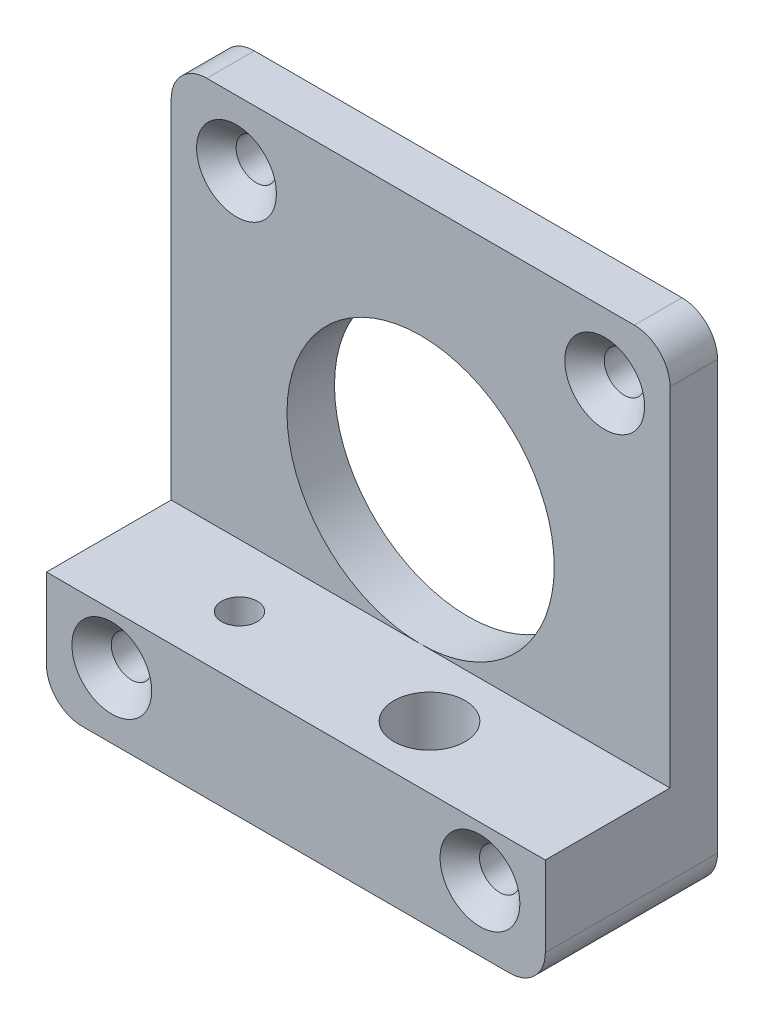
ISO-10303-21;
HEADER;
FILE_DESCRIPTION(('STEP AP214'),'2;1');
FILE_NAME('part.step','',(''),(''),'','','');
FILE_SCHEMA(('AUTOMOTIVE_DESIGN { 1 0 10303 214 1 1 1 1 }'));
ENDSEC;
DATA;
#1=APPLICATION_CONTEXT('core data for automotive mechanical design processes');
#2=APPLICATION_PROTOCOL_DEFINITION('international standard','automotive_design',2000,#1);
#3=PRODUCT_CONTEXT('',#1,'mechanical');
#4=PRODUCT('Part','Part','',(#3));
#5=PRODUCT_RELATED_PRODUCT_CATEGORY('part','',(#4));
#6=PRODUCT_DEFINITION_FORMATION('','',#4);
#7=PRODUCT_DEFINITION_CONTEXT('part definition',#1,'design');
#8=PRODUCT_DEFINITION('design','',#6,#7);
#9=PRODUCT_DEFINITION_SHAPE('','',#8);
#10=(LENGTH_UNIT() NAMED_UNIT(*) SI_UNIT(.MILLI.,.METRE.));
#11=(NAMED_UNIT(*) PLANE_ANGLE_UNIT() SI_UNIT($,.RADIAN.));
#12=(NAMED_UNIT(*) SI_UNIT($,.STERADIAN.) SOLID_ANGLE_UNIT());
#13=UNCERTAINTY_MEASURE_WITH_UNIT(LENGTH_MEASURE(1.E-05),#10,'distance_accuracy_value','');
#14=(GEOMETRIC_REPRESENTATION_CONTEXT(3) GLOBAL_UNCERTAINTY_ASSIGNED_CONTEXT((#13)) GLOBAL_UNIT_ASSIGNED_CONTEXT((#10,
#11,#12)) REPRESENTATION_CONTEXT('',''));
#15=CARTESIAN_POINT('',(0.,0.,0.));
#16=DIRECTION('',(0.,0.,1.));
#17=DIRECTION('',(1.,0.,0.));
#18=AXIS2_PLACEMENT_3D('',#15,#16,#17);
#19=CARTESIAN_POINT('',(-18.,-18.,4.));
#20=DIRECTION('',(0.,0.,1.));
#21=DIRECTION('',(1.,0.,0.));
#22=AXIS2_PLACEMENT_3D('',#19,#20,#21);
#23=PLANE('',#22);
#24=CARTESIAN_POINT('',(-15.5,15.5,4.));
#25=DIRECTION('',(0.,0.,1.));
#26=DIRECTION('',(1.,0.,0.));
#27=AXIS2_PLACEMENT_3D('',#24,#25,#26);
#28=CIRCLE('',#27,3.36);
#29=CARTESIAN_POINT('',(-12.14,15.5,4.));
#30=VERTEX_POINT('',#29);
#31=EDGE_CURVE('E478',#30,#30,#28,.T.);
#32=ORIENTED_EDGE('',*,*,#31,.F.);
#33=EDGE_LOOP('',(#32));
#34=FACE_BOUND('',#33,.T.);
#35=CARTESIAN_POINT('',(15.5,15.5,4.));
#36=DIRECTION('',(0.,0.,1.));
#37=DIRECTION('',(1.,0.,0.));
#38=AXIS2_PLACEMENT_3D('',#35,#36,#37);
#39=CIRCLE('',#38,3.36);
#40=CARTESIAN_POINT('',(18.86,15.5,4.));
#41=VERTEX_POINT('',#40);
#42=EDGE_CURVE('E469',#41,#41,#39,.T.);
#43=ORIENTED_EDGE('',*,*,#42,.F.);
#44=EDGE_LOOP('',(#43));
#45=FACE_BOUND('',#44,.T.);
#46=DIRECTION('',(-1.,0.,0.));
#47=VECTOR('',#46,1.);
#48=CARTESIAN_POINT('',(-21.,-11.25,4.));
#49=LINE('',#48,#47);
#50=CARTESIAN_POINT('',(21.,-11.25,4.));
#51=VERTEX_POINT('',#50);
#52=CARTESIAN_POINT('',(0.,-11.25,4.));
#53=VERTEX_POINT('',#52);
#54=EDGE_CURVE('E42',#51,#53,#49,.T.);
#55=ORIENTED_EDGE('',*,*,#54,.F.);
#56=DIRECTION('',(0.,1.,0.));
#57=VECTOR('',#56,1.);
#58=CARTESIAN_POINT('',(21.,18.,4.));
#59=LINE('',#58,#57);
#60=CARTESIAN_POINT('',(21.,18.,4.));
#61=VERTEX_POINT('',#60);
#62=EDGE_CURVE('E162',#51,#61,#59,.T.);
#63=ORIENTED_EDGE('',*,*,#62,.T.);
#64=CARTESIAN_POINT('',(18.,18.,4.));
#65=DIRECTION('',(0.,0.,1.));
#66=DIRECTION('',(-1.,0.,0.));
#67=AXIS2_PLACEMENT_3D('',#64,#65,#66);
#68=CIRCLE('',#67,3.);
#69=CARTESIAN_POINT('',(18.,21.,4.));
#70=VERTEX_POINT('',#69);
#71=EDGE_CURVE('E164',#61,#70,#68,.T.);
#72=ORIENTED_EDGE('',*,*,#71,.T.);
#73=DIRECTION('',(-1.,0.,0.));
#74=VECTOR('',#73,1.);
#75=CARTESIAN_POINT('',(-18.,21.,4.));
#76=LINE('',#75,#74);
#77=CARTESIAN_POINT('',(-18.,21.,4.));
#78=VERTEX_POINT('',#77);
#79=EDGE_CURVE('E166',#70,#78,#76,.T.);
#80=ORIENTED_EDGE('',*,*,#79,.T.);
#81=CARTESIAN_POINT('',(-18.,18.,4.));
#82=DIRECTION('',(0.,0.,1.));
#83=DIRECTION('',(1.,0.,0.));
#84=AXIS2_PLACEMENT_3D('',#81,#82,#83);
#85=CIRCLE('',#84,3.);
#86=CARTESIAN_POINT('',(-21.,18.,4.));
#87=VERTEX_POINT('',#86);
#88=EDGE_CURVE('E168',#78,#87,#85,.T.);
#89=ORIENTED_EDGE('',*,*,#88,.T.);
#90=DIRECTION('',(0.,-1.,0.));
#91=VECTOR('',#90,1.);
#92=CARTESIAN_POINT('',(-21.,18.,4.));
#93=LINE('',#92,#91);
#94=CARTESIAN_POINT('',(-21.,-11.25,4.));
#95=VERTEX_POINT('',#94);
#96=EDGE_CURVE('E124',#87,#95,#93,.T.);
#97=ORIENTED_EDGE('',*,*,#96,.T.);
#98=EDGE_CURVE('E11',#53,#95,#49,.T.);
#99=ORIENTED_EDGE('',*,*,#98,.F.);
#100=CARTESIAN_POINT('',(0.,0.,4.));
#101=DIRECTION('',(0.,0.,1.));
#102=DIRECTION('',(1.,0.,0.));
#103=AXIS2_PLACEMENT_3D('',#100,#101,#102);
#104=CIRCLE('',#103,11.25);
#105=EDGE_CURVE('E157',#53,#53,#104,.T.);
#106=ORIENTED_EDGE('',*,*,#105,.F.);
#107=EDGE_LOOP('',(#55,#63,#72,#80,#89,#97,#99,#106));
#108=FACE_BOUND('',#107,.T.);
#109=ADVANCED_FACE('F32',(#34,#45,#108),#23,.T.);
#110=CARTESIAN_POINT('',(-18.,-18.,0.));
#111=DIRECTION('',(0.,0.,1.));
#112=DIRECTION('',(1.,0.,0.));
#113=AXIS2_PLACEMENT_3D('',#110,#111,#112);
#114=PLANE('',#113);
#115=CARTESIAN_POINT('',(-15.5,-15.5,0.));
#116=DIRECTION('',(0.,0.,1.));
#117=DIRECTION('',(1.,0.,0.));
#118=AXIS2_PLACEMENT_3D('',#115,#116,#117);
#119=CIRCLE('',#118,1.7);
#120=CARTESIAN_POINT('',(-13.8,-15.5,0.));
#121=VERTEX_POINT('',#120);
#122=EDGE_CURVE('E490',#121,#121,#119,.T.);
#123=ORIENTED_EDGE('',*,*,#122,.T.);
#124=EDGE_LOOP('',(#123));
#125=FACE_BOUND('',#124,.T.);
#126=CARTESIAN_POINT('',(15.5,-15.5,0.));
#127=DIRECTION('',(0.,0.,1.));
#128=DIRECTION('',(1.,0.,0.));
#129=AXIS2_PLACEMENT_3D('',#126,#127,#128);
#130=CIRCLE('',#129,1.7);
#131=CARTESIAN_POINT('',(17.2,-15.5,0.));
#132=VERTEX_POINT('',#131);
#133=EDGE_CURVE('E481',#132,#132,#130,.T.);
#134=ORIENTED_EDGE('',*,*,#133,.T.);
#135=EDGE_LOOP('',(#134));
#136=FACE_BOUND('',#135,.T.);
#137=CARTESIAN_POINT('',(-15.5,15.5,0.));
#138=DIRECTION('',(0.,0.,1.));
#139=DIRECTION('',(1.,0.,0.));
#140=AXIS2_PLACEMENT_3D('',#137,#138,#139);
#141=CIRCLE('',#140,1.7);
#142=CARTESIAN_POINT('',(-13.8,15.5,0.));
#143=VERTEX_POINT('',#142);
#144=EDGE_CURVE('E472',#143,#143,#141,.T.);
#145=ORIENTED_EDGE('',*,*,#144,.T.);
#146=EDGE_LOOP('',(#145));
#147=FACE_BOUND('',#146,.T.);
#148=CARTESIAN_POINT('',(15.5,15.5,0.));
#149=DIRECTION('',(0.,0.,1.));
#150=DIRECTION('',(1.,0.,0.));
#151=AXIS2_PLACEMENT_3D('',#148,#149,#150);
#152=CIRCLE('',#151,1.7);
#153=CARTESIAN_POINT('',(17.2,15.5,0.));
#154=VERTEX_POINT('',#153);
#155=EDGE_CURVE('E459',#154,#154,#152,.T.);
#156=ORIENTED_EDGE('',*,*,#155,.T.);
#157=EDGE_LOOP('',(#156));
#158=FACE_BOUND('',#157,.T.);
#159=CARTESIAN_POINT('',(-18.,-18.,0.));
#160=DIRECTION('',(0.,0.,1.));
#161=DIRECTION('',(1.,0.,0.));
#162=AXIS2_PLACEMENT_3D('',#159,#160,#161);
#163=CIRCLE('',#162,3.);
#164=CARTESIAN_POINT('',(-21.,-18.,0.));
#165=VERTEX_POINT('',#164);
#166=CARTESIAN_POINT('',(-18.,-21.,0.));
#167=VERTEX_POINT('',#166);
#168=EDGE_CURVE('E159',#165,#167,#163,.T.);
#169=ORIENTED_EDGE('',*,*,#168,.F.);
#170=DIRECTION('',(0.,-1.,0.));
#171=VECTOR('',#170,1.);
#172=CARTESIAN_POINT('',(-21.,18.,0.));
#173=LINE('',#172,#171);
#174=CARTESIAN_POINT('',(-21.,18.,0.));
#175=VERTEX_POINT('',#174);
#176=EDGE_CURVE('E119',#175,#165,#173,.T.);
#177=ORIENTED_EDGE('',*,*,#176,.F.);
#178=CARTESIAN_POINT('',(-18.,18.,0.));
#179=DIRECTION('',(0.,0.,1.));
#180=DIRECTION('',(1.,0.,0.));
#181=AXIS2_PLACEMENT_3D('',#178,#179,#180);
#182=CIRCLE('',#181,3.);
#183=CARTESIAN_POINT('',(-18.,21.,0.));
#184=VERTEX_POINT('',#183);
#185=EDGE_CURVE('E182',#184,#175,#182,.T.);
#186=ORIENTED_EDGE('',*,*,#185,.F.);
#187=DIRECTION('',(-1.,0.,0.));
#188=VECTOR('',#187,1.);
#189=CARTESIAN_POINT('',(-18.,21.,0.));
#190=LINE('',#189,#188);
#191=CARTESIAN_POINT('',(18.,21.,0.));
#192=VERTEX_POINT('',#191);
#193=EDGE_CURVE('E180',#192,#184,#190,.T.);
#194=ORIENTED_EDGE('',*,*,#193,.F.);
#195=CARTESIAN_POINT('',(18.,18.,0.));
#196=DIRECTION('',(0.,0.,1.));
#197=DIRECTION('',(-1.,0.,0.));
#198=AXIS2_PLACEMENT_3D('',#195,#196,#197);
#199=CIRCLE('',#198,3.);
#200=CARTESIAN_POINT('',(21.,18.,0.));
#201=VERTEX_POINT('',#200);
#202=EDGE_CURVE('E178',#201,#192,#199,.T.);
#203=ORIENTED_EDGE('',*,*,#202,.F.);
#204=DIRECTION('',(0.,1.,0.));
#205=VECTOR('',#204,1.);
#206=CARTESIAN_POINT('',(21.,18.,0.));
#207=LINE('',#206,#205);
#208=CARTESIAN_POINT('',(21.,-18.,0.));
#209=VERTEX_POINT('',#208);
#210=EDGE_CURVE('E176',#209,#201,#207,.T.);
#211=ORIENTED_EDGE('',*,*,#210,.F.);
#212=CARTESIAN_POINT('',(18.,-18.,0.));
#213=DIRECTION('',(0.,0.,1.));
#214=DIRECTION('',(1.,0.,0.));
#215=AXIS2_PLACEMENT_3D('',#212,#213,#214);
#216=CIRCLE('',#215,2.99999999999999);
#217=CARTESIAN_POINT('',(18.,-21.,0.));
#218=VERTEX_POINT('',#217);
#219=EDGE_CURVE('E174',#218,#209,#216,.T.);
#220=ORIENTED_EDGE('',*,*,#219,.F.);
#221=DIRECTION('',(1.,0.,0.));
#222=VECTOR('',#221,1.);
#223=CARTESIAN_POINT('',(-18.,-21.,0.));
#224=LINE('',#223,#222);
#225=EDGE_CURVE('E172',#167,#218,#224,.T.);
#226=ORIENTED_EDGE('',*,*,#225,.F.);
#227=EDGE_LOOP('',(#169,#177,#186,#194,#203,#211,#220,#226));
#228=FACE_BOUND('',#227,.T.);
#229=CARTESIAN_POINT('',(0.,0.,0.));
#230=DIRECTION('',(0.,0.,1.));
#231=DIRECTION('',(1.,0.,0.));
#232=AXIS2_PLACEMENT_3D('',#229,#230,#231);
#233=CIRCLE('',#232,11.25);
#234=CARTESIAN_POINT('',(11.25,0.,0.));
#235=VERTEX_POINT('',#234);
#236=EDGE_CURVE('E156',#235,#235,#233,.T.);
#237=ORIENTED_EDGE('',*,*,#236,.T.);
#238=EDGE_LOOP('',(#237));
#239=FACE_BOUND('',#238,.T.);
#240=ADVANCED_FACE('F205',(#125,#136,#147,#158,#228,#239),#114,.F.);
#241=CARTESIAN_POINT('',(-18.,-18.,4.));
#242=DIRECTION('',(0.,0.,-1.));
#243=DIRECTION('',(-1.,0.,0.));
#244=AXIS2_PLACEMENT_3D('',#241,#242,#243);
#245=CYLINDRICAL_SURFACE('',#244,3.);
#246=ORIENTED_EDGE('',*,*,#168,.T.);
#247=DIRECTION('',(0.,0.,-1.));
#248=VECTOR('',#247,1.);
#249=CARTESIAN_POINT('',(-18.,-21.,4.));
#250=LINE('',#249,#248);
#251=CARTESIAN_POINT('',(-18.,-21.,14.5));
#252=VERTEX_POINT('',#251);
#253=EDGE_CURVE('E36',#252,#167,#250,.T.);
#254=ORIENTED_EDGE('',*,*,#253,.F.);
#255=CARTESIAN_POINT('',(-18.,-18.,14.5));
#256=DIRECTION('',(0.,0.,1.));
#257=DIRECTION('',(1.,0.,0.));
#258=AXIS2_PLACEMENT_3D('',#255,#256,#257);
#259=CIRCLE('',#258,3.);
#260=CARTESIAN_POINT('',(-21.,-18.,14.5));
#261=VERTEX_POINT('',#260);
#262=EDGE_CURVE('E127',#261,#252,#259,.T.);
#263=ORIENTED_EDGE('',*,*,#262,.F.);
#264=DIRECTION('',(0.,0.,-1.));
#265=VECTOR('',#264,1.);
#266=CARTESIAN_POINT('',(-21.,-18.,4.));
#267=LINE('',#266,#265);
#268=EDGE_CURVE('E111',#261,#165,#267,.T.);
#269=ORIENTED_EDGE('',*,*,#268,.T.);
#270=EDGE_LOOP('',(#246,#254,#263,#269));
#271=FACE_BOUND('',#270,.T.);
#272=ADVANCED_FACE('F34',(#271),#245,.T.);
#273=CARTESIAN_POINT('',(-18.,-21.,4.));
#274=DIRECTION('',(0.,1.,0.));
#275=DIRECTION('',(-1.,0.,0.));
#276=AXIS2_PLACEMENT_3D('',#273,#274,#275);
#277=PLANE('',#276);
#278=CARTESIAN_POINT('',(5.99999999999999,-21.,9.25));
#279=DIRECTION('',(0.,1.,0.));
#280=DIRECTION('',(-1.,0.,0.));
#281=AXIS2_PLACEMENT_3D('',#278,#279,#280);
#282=CIRCLE('',#281,3.);
#283=CARTESIAN_POINT('',(2.99999999999999,-21.,9.25));
#284=VERTEX_POINT('',#283);
#285=EDGE_CURVE('E139',#284,#284,#282,.F.);
#286=ORIENTED_EDGE('',*,*,#285,.F.);
#287=EDGE_LOOP('',(#286));
#288=FACE_BOUND('',#287,.T.);
#289=CARTESIAN_POINT('',(-10.,-21.,9.25));
#290=DIRECTION('',(0.,1.,0.));
#291=DIRECTION('',(-1.,0.,0.));
#292=AXIS2_PLACEMENT_3D('',#289,#290,#291);
#293=CIRCLE('',#292,1.5);
#294=CARTESIAN_POINT('',(-11.5,-21.,9.25));
#295=VERTEX_POINT('',#294);
#296=EDGE_CURVE('E141',#295,#295,#293,.F.);
#297=ORIENTED_EDGE('',*,*,#296,.F.);
#298=EDGE_LOOP('',(#297));
#299=FACE_BOUND('',#298,.T.);
#300=ORIENTED_EDGE('',*,*,#225,.T.);
#301=DIRECTION('',(0.,0.,-1.));
#302=VECTOR('',#301,1.);
#303=CARTESIAN_POINT('',(18.,-21.,4.));
#304=LINE('',#303,#302);
#305=CARTESIAN_POINT('',(18.,-21.,14.5));
#306=VERTEX_POINT('',#305);
#307=EDGE_CURVE('E197',#306,#218,#304,.T.);
#308=ORIENTED_EDGE('',*,*,#307,.F.);
#309=DIRECTION('',(1.,0.,0.));
#310=VECTOR('',#309,1.);
#311=CARTESIAN_POINT('',(-18.,-21.,14.5));
#312=LINE('',#311,#310);
#313=EDGE_CURVE('E132',#252,#306,#312,.T.);
#314=ORIENTED_EDGE('',*,*,#313,.F.);
#315=ORIENTED_EDGE('',*,*,#253,.T.);
#316=EDGE_LOOP('',(#300,#308,#314,#315));
#317=FACE_BOUND('',#316,.T.);
#318=ADVANCED_FACE('F203',(#288,#299,#317),#277,.F.);
#319=CARTESIAN_POINT('',(18.,-18.,4.));
#320=DIRECTION('',(0.,0.,-1.));
#321=DIRECTION('',(-1.,0.,0.));
#322=AXIS2_PLACEMENT_3D('',#319,#320,#321);
#323=CYLINDRICAL_SURFACE('',#322,2.99999999999999);
#324=ORIENTED_EDGE('',*,*,#219,.T.);
#325=DIRECTION('',(0.,0.,-1.));
#326=VECTOR('',#325,1.);
#327=CARTESIAN_POINT('',(21.,-18.,4.));
#328=LINE('',#327,#326);
#329=CARTESIAN_POINT('',(21.,-18.,14.5));
#330=VERTEX_POINT('',#329);
#331=EDGE_CURVE('E195',#330,#209,#328,.T.);
#332=ORIENTED_EDGE('',*,*,#331,.F.);
#333=CARTESIAN_POINT('',(18.,-18.,14.5));
#334=DIRECTION('',(0.,0.,1.));
#335=DIRECTION('',(1.,0.,0.));
#336=AXIS2_PLACEMENT_3D('',#333,#334,#335);
#337=CIRCLE('',#336,3.);
#338=EDGE_CURVE('E145',#306,#330,#337,.T.);
#339=ORIENTED_EDGE('',*,*,#338,.F.);
#340=ORIENTED_EDGE('',*,*,#307,.T.);
#341=EDGE_LOOP('',(#324,#332,#339,#340));
#342=FACE_BOUND('',#341,.T.);
#343=ADVANCED_FACE('F210',(#342),#323,.T.);
#344=CARTESIAN_POINT('',(21.,18.,4.));
#345=DIRECTION('',(-1.,0.,0.));
#346=DIRECTION('',(0.,0.,1.));
#347=AXIS2_PLACEMENT_3D('',#344,#345,#346);
#348=PLANE('',#347);
#349=ORIENTED_EDGE('',*,*,#210,.T.);
#350=DIRECTION('',(0.,0.,-1.));
#351=VECTOR('',#350,1.);
#352=CARTESIAN_POINT('',(21.,18.,4.));
#353=LINE('',#352,#351);
#354=EDGE_CURVE('E192',#61,#201,#353,.T.);
#355=ORIENTED_EDGE('',*,*,#354,.F.);
#356=ORIENTED_EDGE('',*,*,#62,.F.);
#357=DIRECTION('',(0.,0.,-1.));
#358=VECTOR('',#357,1.);
#359=CARTESIAN_POINT('',(21.,-11.25,14.5));
#360=LINE('',#359,#358);
#361=CARTESIAN_POINT('',(21.,-11.25,14.5));
#362=VERTEX_POINT('',#361);
#363=EDGE_CURVE('E153',#362,#51,#360,.T.);
#364=ORIENTED_EDGE('',*,*,#363,.F.);
#365=DIRECTION('',(0.,1.,0.));
#366=VECTOR('',#365,1.);
#367=CARTESIAN_POINT('',(21.,-11.25,14.5));
#368=LINE('',#367,#366);
#369=EDGE_CURVE('E148',#330,#362,#368,.T.);
#370=ORIENTED_EDGE('',*,*,#369,.F.);
#371=ORIENTED_EDGE('',*,*,#331,.T.);
#372=EDGE_LOOP('',(#349,#355,#356,#364,#370,#371));
#373=FACE_BOUND('',#372,.T.);
#374=ADVANCED_FACE('F213',(#373),#348,.F.);
#375=CARTESIAN_POINT('',(18.,18.,4.));
#376=DIRECTION('',(0.,0.,-1.));
#377=DIRECTION('',(-1.,0.,0.));
#378=AXIS2_PLACEMENT_3D('',#375,#376,#377);
#379=CYLINDRICAL_SURFACE('',#378,3.);
#380=ORIENTED_EDGE('',*,*,#202,.T.);
#381=DIRECTION('',(0.,0.,-1.));
#382=VECTOR('',#381,1.);
#383=CARTESIAN_POINT('',(18.,21.,4.));
#384=LINE('',#383,#382);
#385=EDGE_CURVE('E189',#70,#192,#384,.T.);
#386=ORIENTED_EDGE('',*,*,#385,.F.);
#387=ORIENTED_EDGE('',*,*,#71,.F.);
#388=ORIENTED_EDGE('',*,*,#354,.T.);
#389=EDGE_LOOP('',(#380,#386,#387,#388));
#390=FACE_BOUND('',#389,.T.);
#391=ADVANCED_FACE('F231',(#390),#379,.T.);
#392=CARTESIAN_POINT('',(-18.,21.,4.));
#393=DIRECTION('',(0.,-1.,0.));
#394=DIRECTION('',(0.,0.,-1.));
#395=AXIS2_PLACEMENT_3D('',#392,#393,#394);
#396=PLANE('',#395);
#397=ORIENTED_EDGE('',*,*,#193,.T.);
#398=DIRECTION('',(0.,0.,-1.));
#399=VECTOR('',#398,1.);
#400=CARTESIAN_POINT('',(-18.,21.,4.));
#401=LINE('',#400,#399);
#402=EDGE_CURVE('E186',#78,#184,#401,.T.);
#403=ORIENTED_EDGE('',*,*,#402,.F.);
#404=ORIENTED_EDGE('',*,*,#79,.F.);
#405=ORIENTED_EDGE('',*,*,#385,.T.);
#406=EDGE_LOOP('',(#397,#403,#404,#405));
#407=FACE_BOUND('',#406,.T.);
#408=ADVANCED_FACE('F227',(#407),#396,.F.);
#409=CARTESIAN_POINT('',(-18.,18.,4.));
#410=DIRECTION('',(0.,0.,-1.));
#411=DIRECTION('',(-1.,0.,0.));
#412=AXIS2_PLACEMENT_3D('',#409,#410,#411);
#413=CYLINDRICAL_SURFACE('',#412,3.);
#414=ORIENTED_EDGE('',*,*,#185,.T.);
#415=DIRECTION('',(0.,0.,-1.));
#416=VECTOR('',#415,1.);
#417=CARTESIAN_POINT('',(-21.,18.,4.));
#418=LINE('',#417,#416);
#419=EDGE_CURVE('E123',#87,#175,#418,.T.);
#420=ORIENTED_EDGE('',*,*,#419,.F.);
#421=ORIENTED_EDGE('',*,*,#88,.F.);
#422=ORIENTED_EDGE('',*,*,#402,.T.);
#423=EDGE_LOOP('',(#414,#420,#421,#422));
#424=FACE_BOUND('',#423,.T.);
#425=ADVANCED_FACE('F224',(#424),#413,.T.);
#426=CARTESIAN_POINT('',(-21.,18.,4.));
#427=DIRECTION('',(1.,0.,0.));
#428=DIRECTION('',(0.,1.,0.));
#429=AXIS2_PLACEMENT_3D('',#426,#427,#428);
#430=PLANE('',#429);
#431=ORIENTED_EDGE('',*,*,#176,.T.);
#432=ORIENTED_EDGE('',*,*,#268,.F.);
#433=DIRECTION('',(0.,-1.,0.));
#434=VECTOR('',#433,1.);
#435=CARTESIAN_POINT('',(-21.,-11.25,14.5));
#436=LINE('',#435,#434);
#437=CARTESIAN_POINT('',(-21.,-11.25,14.5));
#438=VERTEX_POINT('',#437);
#439=EDGE_CURVE('E116',#438,#261,#436,.T.);
#440=ORIENTED_EDGE('',*,*,#439,.F.);
#441=DIRECTION('',(0.,0.,-1.));
#442=VECTOR('',#441,1.);
#443=CARTESIAN_POINT('',(-21.,-11.25,14.5));
#444=LINE('',#443,#442);
#445=EDGE_CURVE('E150',#438,#95,#444,.T.);
#446=ORIENTED_EDGE('',*,*,#445,.T.);
#447=ORIENTED_EDGE('',*,*,#96,.F.);
#448=ORIENTED_EDGE('',*,*,#419,.T.);
#449=EDGE_LOOP('',(#431,#432,#440,#446,#447,#448));
#450=FACE_BOUND('',#449,.T.);
#451=ADVANCED_FACE('F113',(#450),#430,.F.);
#452=CARTESIAN_POINT('',(0.,0.,4.));
#453=DIRECTION('',(0.,0.,-1.));
#454=DIRECTION('',(-1.,0.,0.));
#455=AXIS2_PLACEMENT_3D('',#452,#453,#454);
#456=CYLINDRICAL_SURFACE('',#455,11.25);
#457=ORIENTED_EDGE('',*,*,#105,.T.);
#458=EDGE_LOOP('',(#457));
#459=FACE_BOUND('',#458,.T.);
#460=ORIENTED_EDGE('',*,*,#236,.F.);
#461=EDGE_LOOP('',(#460));
#462=FACE_BOUND('',#461,.T.);
#463=ADVANCED_FACE('F251',(#459,#462),#456,.F.);
#464=CARTESIAN_POINT('',(-18.,-18.,14.5));
#465=DIRECTION('',(0.,0.,1.));
#466=DIRECTION('',(1.,0.,0.));
#467=AXIS2_PLACEMENT_3D('',#464,#465,#466);
#468=PLANE('',#467);
#469=CARTESIAN_POINT('',(-15.5,-15.5,14.5));
#470=DIRECTION('',(0.,0.,1.));
#471=DIRECTION('',(1.,0.,0.));
#472=AXIS2_PLACEMENT_3D('',#469,#470,#471);
#473=CIRCLE('',#472,3.36);
#474=CARTESIAN_POINT('',(-12.14,-15.5,14.5));
#475=VERTEX_POINT('',#474);
#476=EDGE_CURVE('E496',#475,#475,#473,.T.);
#477=ORIENTED_EDGE('',*,*,#476,.F.);
#478=EDGE_LOOP('',(#477));
#479=FACE_BOUND('',#478,.T.);
#480=CARTESIAN_POINT('',(15.5,-15.5,14.5));
#481=DIRECTION('',(0.,0.,1.));
#482=DIRECTION('',(1.,0.,0.));
#483=AXIS2_PLACEMENT_3D('',#480,#481,#482);
#484=CIRCLE('',#483,3.36);
#485=CARTESIAN_POINT('',(18.86,-15.5,14.5));
#486=VERTEX_POINT('',#485);
#487=EDGE_CURVE('E487',#486,#486,#484,.T.);
#488=ORIENTED_EDGE('',*,*,#487,.F.);
#489=EDGE_LOOP('',(#488));
#490=FACE_BOUND('',#489,.T.);
#491=ORIENTED_EDGE('',*,*,#439,.T.);
#492=ORIENTED_EDGE('',*,*,#262,.T.);
#493=ORIENTED_EDGE('',*,*,#313,.T.);
#494=ORIENTED_EDGE('',*,*,#338,.T.);
#495=ORIENTED_EDGE('',*,*,#369,.T.);
#496=DIRECTION('',(-1.,0.,0.));
#497=VECTOR('',#496,1.);
#498=CARTESIAN_POINT('',(-21.,-11.25,14.5));
#499=LINE('',#498,#497);
#500=EDGE_CURVE('E136',#362,#438,#499,.T.);
#501=ORIENTED_EDGE('',*,*,#500,.T.);
#502=EDGE_LOOP('',(#491,#492,#493,#494,#495,#501));
#503=FACE_BOUND('',#502,.T.);
#504=ADVANCED_FACE('F134',(#479,#490,#503),#468,.T.);
#505=CARTESIAN_POINT('',(-21.,-11.25,14.5));
#506=DIRECTION('',(0.,-1.,0.));
#507=DIRECTION('',(1.,0.,0.));
#508=AXIS2_PLACEMENT_3D('',#505,#506,#507);
#509=PLANE('',#508);
#510=CARTESIAN_POINT('',(5.99999999999999,-11.25,9.25));
#511=DIRECTION('',(0.,1.,0.));
#512=DIRECTION('',(-1.,0.,0.));
#513=AXIS2_PLACEMENT_3D('',#510,#511,#512);
#514=CIRCLE('',#513,3.);
#515=CARTESIAN_POINT('',(2.99999999999999,-11.25,9.25));
#516=VERTEX_POINT('',#515);
#517=EDGE_CURVE('E454',#516,#516,#514,.T.);
#518=ORIENTED_EDGE('',*,*,#517,.F.);
#519=EDGE_LOOP('',(#518));
#520=FACE_BOUND('',#519,.T.);
#521=CARTESIAN_POINT('',(-10.,-11.25,9.25));
#522=DIRECTION('',(0.,1.,0.));
#523=DIRECTION('',(-1.,0.,0.));
#524=AXIS2_PLACEMENT_3D('',#521,#522,#523);
#525=CIRCLE('',#524,1.5);
#526=CARTESIAN_POINT('',(-11.5,-11.25,9.25));
#527=VERTEX_POINT('',#526);
#528=EDGE_CURVE('E455',#527,#527,#525,.T.);
#529=ORIENTED_EDGE('',*,*,#528,.F.);
#530=EDGE_LOOP('',(#529));
#531=FACE_BOUND('',#530,.T.);
#532=ORIENTED_EDGE('',*,*,#54,.T.);
#533=ORIENTED_EDGE('',*,*,#98,.T.);
#534=ORIENTED_EDGE('',*,*,#445,.F.);
#535=ORIENTED_EDGE('',*,*,#500,.F.);
#536=ORIENTED_EDGE('',*,*,#363,.T.);
#537=EDGE_LOOP('',(#532,#533,#534,#535,#536));
#538=FACE_BOUND('',#537,.T.);
#539=ADVANCED_FACE('F217',(#520,#531,#538),#509,.F.);
#540=CARTESIAN_POINT('',(-10.,-29.4852813742386,9.25));
#541=DIRECTION('',(0.,1.,0.));
#542=DIRECTION('',(-1.,0.,0.));
#543=AXIS2_PLACEMENT_3D('',#540,#541,#542);
#544=CYLINDRICAL_SURFACE('',#543,1.5);
#545=ORIENTED_EDGE('',*,*,#296,.T.);
#546=EDGE_LOOP('',(#545));
#547=FACE_BOUND('',#546,.T.);
#548=ORIENTED_EDGE('',*,*,#528,.T.);
#549=EDGE_LOOP('',(#548));
#550=FACE_BOUND('',#549,.T.);
#551=ADVANCED_FACE('F289',(#547,#550),#544,.F.);
#552=CARTESIAN_POINT('',(5.99999999999999,-29.4852813742386,9.25));
#553=DIRECTION('',(0.,1.,0.));
#554=DIRECTION('',(-1.,0.,0.));
#555=AXIS2_PLACEMENT_3D('',#552,#553,#554);
#556=CYLINDRICAL_SURFACE('',#555,3.);
#557=ORIENTED_EDGE('',*,*,#285,.T.);
#558=EDGE_LOOP('',(#557));
#559=FACE_BOUND('',#558,.T.);
#560=ORIENTED_EDGE('',*,*,#517,.T.);
#561=EDGE_LOOP('',(#560));
#562=FACE_BOUND('',#561,.T.);
#563=ADVANCED_FACE('F296',(#559,#562),#556,.F.);
#564=CARTESIAN_POINT('',(15.5,15.5,4.));
#565=DIRECTION('',(0.,0.,1.));
#566=DIRECTION('',(1.,0.,0.));
#567=AXIS2_PLACEMENT_3D('',#564,#565,#566);
#568=CYLINDRICAL_SURFACE('',#567,1.7);
#569=ORIENTED_EDGE('',*,*,#155,.F.);
#570=EDGE_LOOP('',(#569));
#571=FACE_BOUND('',#570,.T.);
#572=CARTESIAN_POINT('',(15.5,15.5,2.33999999999999));
#573=DIRECTION('',(0.,0.,1.));
#574=DIRECTION('',(1.,0.,0.));
#575=AXIS2_PLACEMENT_3D('',#572,#573,#574);
#576=CIRCLE('',#575,1.7);
#577=CARTESIAN_POINT('',(17.2,15.5,2.33999999999999));
#578=VERTEX_POINT('',#577);
#579=EDGE_CURVE('E463',#578,#578,#576,.T.);
#580=ORIENTED_EDGE('',*,*,#579,.T.);
#581=EDGE_LOOP('',(#580));
#582=FACE_BOUND('',#581,.T.);
#583=ADVANCED_FACE('F304',(#571,#582),#568,.F.);
#584=CARTESIAN_POINT('',(15.5,15.5,4.));
#585=DIRECTION('',(0.,0.,1.));
#586=DIRECTION('',(1.,0.,0.));
#587=AXIS2_PLACEMENT_3D('',#584,#585,#586);
#588=CONICAL_SURFACE('',#587,3.36,0.785398163397446);
#589=ORIENTED_EDGE('',*,*,#579,.F.);
#590=EDGE_LOOP('',(#589));
#591=FACE_BOUND('',#590,.T.);
#592=ORIENTED_EDGE('',*,*,#42,.T.);
#593=EDGE_LOOP('',(#592));
#594=FACE_BOUND('',#593,.T.);
#595=ADVANCED_FACE('F312',(#591,#594),#588,.F.);
#596=CARTESIAN_POINT('',(-15.5,15.5,4.));
#597=DIRECTION('',(0.,0.,1.));
#598=DIRECTION('',(1.,0.,0.));
#599=AXIS2_PLACEMENT_3D('',#596,#597,#598);
#600=CYLINDRICAL_SURFACE('',#599,1.7);
#601=ORIENTED_EDGE('',*,*,#144,.F.);
#602=EDGE_LOOP('',(#601));
#603=FACE_BOUND('',#602,.T.);
#604=CARTESIAN_POINT('',(-15.5,15.5,2.33999999999999));
#605=DIRECTION('',(0.,0.,1.));
#606=DIRECTION('',(1.,0.,0.));
#607=AXIS2_PLACEMENT_3D('',#604,#605,#606);
#608=CIRCLE('',#607,1.7);
#609=CARTESIAN_POINT('',(-13.8,15.5,2.33999999999999));
#610=VERTEX_POINT('',#609);
#611=EDGE_CURVE('E475',#610,#610,#608,.T.);
#612=ORIENTED_EDGE('',*,*,#611,.T.);
#613=EDGE_LOOP('',(#612));
#614=FACE_BOUND('',#613,.T.);
#615=ADVANCED_FACE('F320',(#603,#614),#600,.F.);
#616=CARTESIAN_POINT('',(-15.5,15.5,4.));
#617=DIRECTION('',(0.,0.,1.));
#618=DIRECTION('',(1.,0.,0.));
#619=AXIS2_PLACEMENT_3D('',#616,#617,#618);
#620=CONICAL_SURFACE('',#619,3.36,0.785398163397445);
#621=ORIENTED_EDGE('',*,*,#611,.F.);
#622=EDGE_LOOP('',(#621));
#623=FACE_BOUND('',#622,.T.);
#624=ORIENTED_EDGE('',*,*,#31,.T.);
#625=EDGE_LOOP('',(#624));
#626=FACE_BOUND('',#625,.T.);
#627=ADVANCED_FACE('F328',(#623,#626),#620,.F.);
#628=CARTESIAN_POINT('',(15.5,-15.5,14.5));
#629=DIRECTION('',(0.,0.,1.));
#630=DIRECTION('',(1.,0.,0.));
#631=AXIS2_PLACEMENT_3D('',#628,#629,#630);
#632=CYLINDRICAL_SURFACE('',#631,1.69999999999999);
#633=ORIENTED_EDGE('',*,*,#133,.F.);
#634=EDGE_LOOP('',(#633));
#635=FACE_BOUND('',#634,.T.);
#636=CARTESIAN_POINT('',(15.5,-15.5,12.84));
#637=DIRECTION('',(0.,0.,1.));
#638=DIRECTION('',(1.,0.,0.));
#639=AXIS2_PLACEMENT_3D('',#636,#637,#638);
#640=CIRCLE('',#639,1.69999999999999);
#641=CARTESIAN_POINT('',(17.2,-15.5,12.84));
#642=VERTEX_POINT('',#641);
#643=EDGE_CURVE('E484',#642,#642,#640,.T.);
#644=ORIENTED_EDGE('',*,*,#643,.T.);
#645=EDGE_LOOP('',(#644));
#646=FACE_BOUND('',#645,.T.);
#647=ADVANCED_FACE('F336',(#635,#646),#632,.F.);
#648=CARTESIAN_POINT('',(15.5,-15.5,14.5));
#649=DIRECTION('',(0.,0.,1.));
#650=DIRECTION('',(1.,0.,0.));
#651=AXIS2_PLACEMENT_3D('',#648,#649,#650);
#652=CONICAL_SURFACE('',#651,3.36,0.785398163397446);
#653=ORIENTED_EDGE('',*,*,#643,.F.);
#654=EDGE_LOOP('',(#653));
#655=FACE_BOUND('',#654,.T.);
#656=ORIENTED_EDGE('',*,*,#487,.T.);
#657=EDGE_LOOP('',(#656));
#658=FACE_BOUND('',#657,.T.);
#659=ADVANCED_FACE('F343',(#655,#658),#652,.F.);
#660=CARTESIAN_POINT('',(-15.5,-15.5,14.5));
#661=DIRECTION('',(0.,0.,1.));
#662=DIRECTION('',(1.,0.,0.));
#663=AXIS2_PLACEMENT_3D('',#660,#661,#662);
#664=CYLINDRICAL_SURFACE('',#663,1.69999999999999);
#665=ORIENTED_EDGE('',*,*,#122,.F.);
#666=EDGE_LOOP('',(#665));
#667=FACE_BOUND('',#666,.T.);
#668=CARTESIAN_POINT('',(-15.5,-15.5,12.84));
#669=DIRECTION('',(0.,0.,1.));
#670=DIRECTION('',(1.,0.,0.));
#671=AXIS2_PLACEMENT_3D('',#668,#669,#670);
#672=CIRCLE('',#671,1.69999999999999);
#673=CARTESIAN_POINT('',(-13.8,-15.5,12.84));
#674=VERTEX_POINT('',#673);
#675=EDGE_CURVE('E493',#674,#674,#672,.T.);
#676=ORIENTED_EDGE('',*,*,#675,.T.);
#677=EDGE_LOOP('',(#676));
#678=FACE_BOUND('',#677,.T.);
#679=ADVANCED_FACE('F351',(#667,#678),#664,.F.);
#680=CARTESIAN_POINT('',(-15.5,-15.5,14.5));
#681=DIRECTION('',(0.,0.,1.));
#682=DIRECTION('',(1.,0.,0.));
#683=AXIS2_PLACEMENT_3D('',#680,#681,#682);
#684=CONICAL_SURFACE('',#683,3.36,0.785398163397445);
#685=ORIENTED_EDGE('',*,*,#675,.F.);
#686=EDGE_LOOP('',(#685));
#687=FACE_BOUND('',#686,.T.);
#688=ORIENTED_EDGE('',*,*,#476,.T.);
#689=EDGE_LOOP('',(#688));
#690=FACE_BOUND('',#689,.T.);
#691=ADVANCED_FACE('F359',(#687,#690),#684,.F.);
#692=CLOSED_SHELL('',(#109,#240,#272,#318,#343,#374,#391,#408,#425,#451,#463,#504,#539,#551,
#563,#583,#595,#615,#627,#647,#659,#679,#691));
#693=MANIFOLD_SOLID_BREP('B2',#692);
#694=ADVANCED_BREP_SHAPE_REPRESENTATION('',(#18,#693),#14);
#695=SHAPE_DEFINITION_REPRESENTATION(#9,#694);
ENDSEC;
END-ISO-10303-21;
